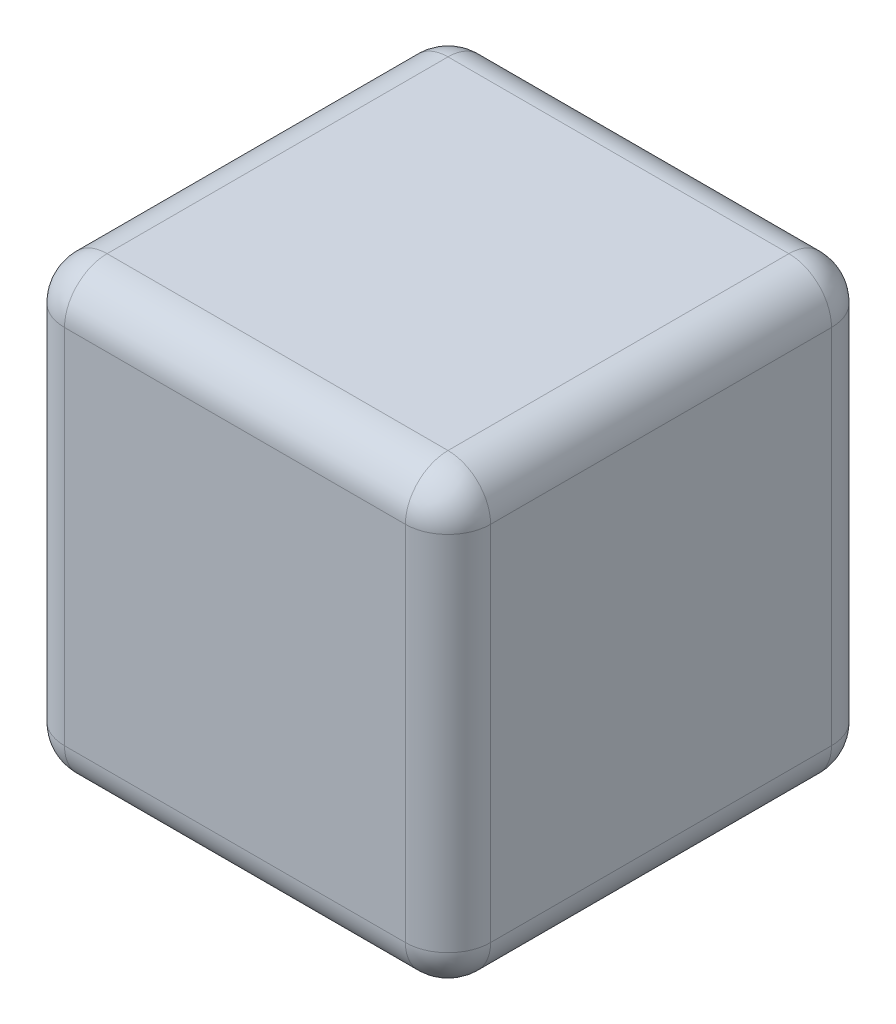
ISO-10303-21;
HEADER;
FILE_DESCRIPTION(('STEP AP214'),'2;1');
FILE_NAME('part.step','',(''),(''),'','','');
FILE_SCHEMA(('AUTOMOTIVE_DESIGN { 1 0 10303 214 1 1 1 1 }'));
ENDSEC;
DATA;
#1=APPLICATION_CONTEXT('core data for automotive mechanical design processes');
#2=APPLICATION_PROTOCOL_DEFINITION('international standard','automotive_design',2000,#1);
#3=PRODUCT_CONTEXT('',#1,'mechanical');
#4=PRODUCT('Part','Part','',(#3));
#5=PRODUCT_RELATED_PRODUCT_CATEGORY('part','',(#4));
#6=PRODUCT_DEFINITION_FORMATION('','',#4);
#7=PRODUCT_DEFINITION_CONTEXT('part definition',#1,'design');
#8=PRODUCT_DEFINITION('design','',#6,#7);
#9=PRODUCT_DEFINITION_SHAPE('','',#8);
#10=(LENGTH_UNIT() NAMED_UNIT(*) SI_UNIT(.MILLI.,.METRE.));
#11=(NAMED_UNIT(*) PLANE_ANGLE_UNIT() SI_UNIT($,.RADIAN.));
#12=(NAMED_UNIT(*) SI_UNIT($,.STERADIAN.) SOLID_ANGLE_UNIT());
#13=UNCERTAINTY_MEASURE_WITH_UNIT(LENGTH_MEASURE(1.E-05),#10,'distance_accuracy_value','');
#14=(GEOMETRIC_REPRESENTATION_CONTEXT(3) GLOBAL_UNCERTAINTY_ASSIGNED_CONTEXT((#13)) GLOBAL_UNIT_ASSIGNED_CONTEXT((#10,
#11,#12)) REPRESENTATION_CONTEXT('',''));
#15=CARTESIAN_POINT('',(0.,0.,0.));
#16=DIRECTION('',(0.,0.,1.));
#17=DIRECTION('',(1.,0.,0.));
#18=AXIS2_PLACEMENT_3D('',#15,#16,#17);
#19=CARTESIAN_POINT('',(0.,105.,0.));
#20=DIRECTION('',(1.,0.,0.));
#21=DIRECTION('',(0.,0.,-1.));
#22=AXIS2_PLACEMENT_3D('',#19,#20,#21);
#23=PLANE('',#22);
#24=DIRECTION('',(0.,0.,1.));
#25=VECTOR('',#24,1.);
#26=CARTESIAN_POINT('',(0.,95.,0.));
#27=LINE('',#26,#25);
#28=CARTESIAN_POINT('',(0.,95.,-10.));
#29=VERTEX_POINT('',#28);
#30=CARTESIAN_POINT('',(0.,95.,-90.));
#31=VERTEX_POINT('',#30);
#32=EDGE_CURVE('E173',#29,#31,#27,.F.);
#33=ORIENTED_EDGE('',*,*,#32,.T.);
#34=DIRECTION('',(0.,-1.,0.));
#35=VECTOR('',#34,1.);
#36=CARTESIAN_POINT('',(0.,105.,-90.));
#37=LINE('',#36,#35);
#38=CARTESIAN_POINT('',(0.,9.99999999999999,-90.));
#39=VERTEX_POINT('',#38);
#40=EDGE_CURVE('E179',#31,#39,#37,.T.);
#41=ORIENTED_EDGE('',*,*,#40,.T.);
#42=DIRECTION('',(0.,0.,1.));
#43=VECTOR('',#42,1.);
#44=CARTESIAN_POINT('',(0.,9.99999999999999,0.));
#45=LINE('',#44,#43);
#46=CARTESIAN_POINT('',(0.,9.99999999999999,-10.));
#47=VERTEX_POINT('',#46);
#48=EDGE_CURVE('E177',#39,#47,#45,.T.);
#49=ORIENTED_EDGE('',*,*,#48,.T.);
#50=DIRECTION('',(0.,-1.,0.));
#51=VECTOR('',#50,1.);
#52=CARTESIAN_POINT('',(0.,105.,-10.));
#53=LINE('',#52,#51);
#54=EDGE_CURVE('E175',#47,#29,#53,.F.);
#55=ORIENTED_EDGE('',*,*,#54,.T.);
#56=EDGE_LOOP('',(#33,#41,#49,#55));
#57=FACE_BOUND('',#56,.T.);
#58=ADVANCED_FACE('F33',(#57),#23,.F.);
#59=CARTESIAN_POINT('',(0.,105.,0.));
#60=DIRECTION('',(0.,0.,-1.));
#61=DIRECTION('',(-1.,0.,0.));
#62=AXIS2_PLACEMENT_3D('',#59,#60,#61);
#63=PLANE('',#62);
#64=DIRECTION('',(1.,0.,0.));
#65=VECTOR('',#64,1.);
#66=CARTESIAN_POINT('',(0.,95.,0.));
#67=LINE('',#66,#65);
#68=CARTESIAN_POINT('',(90.,95.,0.));
#69=VERTEX_POINT('',#68);
#70=CARTESIAN_POINT('',(10.,95.,0.));
#71=VERTEX_POINT('',#70);
#72=EDGE_CURVE('E184',#69,#71,#67,.F.);
#73=ORIENTED_EDGE('',*,*,#72,.T.);
#74=DIRECTION('',(0.,-1.,0.));
#75=VECTOR('',#74,1.);
#76=CARTESIAN_POINT('',(10.,105.,0.));
#77=LINE('',#76,#75);
#78=CARTESIAN_POINT('',(10.,9.99999999999999,0.));
#79=VERTEX_POINT('',#78);
#80=EDGE_CURVE('E188',#71,#79,#77,.T.);
#81=ORIENTED_EDGE('',*,*,#80,.T.);
#82=DIRECTION('',(1.,0.,0.));
#83=VECTOR('',#82,1.);
#84=CARTESIAN_POINT('',(100.,9.99999999999999,0.));
#85=LINE('',#84,#83);
#86=CARTESIAN_POINT('',(90.,9.99999999999999,0.));
#87=VERTEX_POINT('',#86);
#88=EDGE_CURVE('E186',#79,#87,#85,.T.);
#89=ORIENTED_EDGE('',*,*,#88,.T.);
#90=DIRECTION('',(0.,-1.,0.));
#91=VECTOR('',#90,1.);
#92=CARTESIAN_POINT('',(90.,105.,0.));
#93=LINE('',#92,#91);
#94=EDGE_CURVE('E182',#87,#69,#93,.F.);
#95=ORIENTED_EDGE('',*,*,#94,.T.);
#96=EDGE_LOOP('',(#73,#81,#89,#95));
#97=FACE_BOUND('',#96,.T.);
#98=ADVANCED_FACE('F272',(#97),#63,.F.);
#99=CARTESIAN_POINT('',(100.,105.,0.));
#100=DIRECTION('',(-1.,0.,0.));
#101=DIRECTION('',(0.,0.,1.));
#102=AXIS2_PLACEMENT_3D('',#99,#100,#101);
#103=PLANE('',#102);
#104=DIRECTION('',(0.,0.,-1.));
#105=VECTOR('',#104,1.);
#106=CARTESIAN_POINT('',(100.,95.,0.));
#107=LINE('',#106,#105);
#108=CARTESIAN_POINT('',(100.,95.,-90.));
#109=VERTEX_POINT('',#108);
#110=CARTESIAN_POINT('',(100.,95.,-10.));
#111=VERTEX_POINT('',#110);
#112=EDGE_CURVE('E42',#109,#111,#107,.F.);
#113=ORIENTED_EDGE('',*,*,#112,.T.);
#114=DIRECTION('',(0.,-1.,0.));
#115=VECTOR('',#114,1.);
#116=CARTESIAN_POINT('',(100.,105.,-10.));
#117=LINE('',#116,#115);
#118=CARTESIAN_POINT('',(100.,9.99999999999999,-10.));
#119=VERTEX_POINT('',#118);
#120=EDGE_CURVE('E11',#111,#119,#117,.T.);
#121=ORIENTED_EDGE('',*,*,#120,.T.);
#122=DIRECTION('',(0.,0.,-1.));
#123=VECTOR('',#122,1.);
#124=CARTESIAN_POINT('',(100.,9.99999999999999,-100.));
#125=LINE('',#124,#123);
#126=CARTESIAN_POINT('',(100.,9.99999999999999,-90.));
#127=VERTEX_POINT('',#126);
#128=EDGE_CURVE('E198',#119,#127,#125,.T.);
#129=ORIENTED_EDGE('',*,*,#128,.T.);
#130=DIRECTION('',(0.,-1.,0.));
#131=VECTOR('',#130,1.);
#132=CARTESIAN_POINT('',(100.,105.,-90.));
#133=LINE('',#132,#131);
#134=EDGE_CURVE('E53',#127,#109,#133,.F.);
#135=ORIENTED_EDGE('',*,*,#134,.T.);
#136=EDGE_LOOP('',(#113,#121,#129,#135));
#137=FACE_BOUND('',#136,.T.);
#138=ADVANCED_FACE('F285',(#137),#103,.F.);
#139=CARTESIAN_POINT('',(0.,105.,-100.));
#140=DIRECTION('',(0.,0.,1.));
#141=DIRECTION('',(1.,0.,0.));
#142=AXIS2_PLACEMENT_3D('',#139,#140,#141);
#143=PLANE('',#142);
#144=DIRECTION('',(0.,-1.,0.));
#145=VECTOR('',#144,1.);
#146=CARTESIAN_POINT('',(90.,105.,-100.));
#147=LINE('',#146,#145);
#148=CARTESIAN_POINT('',(90.,95.,-100.));
#149=VERTEX_POINT('',#148);
#150=CARTESIAN_POINT('',(90.,9.99999999999999,-100.));
#151=VERTEX_POINT('',#150);
#152=EDGE_CURVE('E125',#149,#151,#147,.T.);
#153=ORIENTED_EDGE('',*,*,#152,.T.);
#154=DIRECTION('',(-1.,0.,0.));
#155=VECTOR('',#154,1.);
#156=CARTESIAN_POINT('',(0.,9.99999999999999,-100.));
#157=LINE('',#156,#155);
#158=CARTESIAN_POINT('',(10.,9.99999999999999,-100.));
#159=VERTEX_POINT('',#158);
#160=EDGE_CURVE('E162',#151,#159,#157,.T.);
#161=ORIENTED_EDGE('',*,*,#160,.T.);
#162=DIRECTION('',(0.,-1.,0.));
#163=VECTOR('',#162,1.);
#164=CARTESIAN_POINT('',(10.,105.,-100.));
#165=LINE('',#164,#163);
#166=CARTESIAN_POINT('',(10.,95.,-100.));
#167=VERTEX_POINT('',#166);
#168=EDGE_CURVE('E128',#159,#167,#165,.F.);
#169=ORIENTED_EDGE('',*,*,#168,.T.);
#170=DIRECTION('',(-1.,0.,0.));
#171=VECTOR('',#170,1.);
#172=CARTESIAN_POINT('',(0.,95.,-100.));
#173=LINE('',#172,#171);
#174=EDGE_CURVE('E120',#167,#149,#173,.F.);
#175=ORIENTED_EDGE('',*,*,#174,.T.);
#176=EDGE_LOOP('',(#153,#161,#169,#175));
#177=FACE_BOUND('',#176,.T.);
#178=ADVANCED_FACE('F122',(#177),#143,.F.);
#179=CARTESIAN_POINT('',(0.,105.,0.));
#180=DIRECTION('',(0.,-1.,0.));
#181=DIRECTION('',(0.,0.,-1.));
#182=AXIS2_PLACEMENT_3D('',#179,#180,#181);
#183=PLANE('',#182);
#184=DIRECTION('',(-1.,0.,0.));
#185=VECTOR('',#184,1.);
#186=CARTESIAN_POINT('',(0.,105.,-90.));
#187=LINE('',#186,#185);
#188=CARTESIAN_POINT('',(90.,105.,-90.));
#189=VERTEX_POINT('',#188);
#190=CARTESIAN_POINT('',(10.,105.,-90.));
#191=VERTEX_POINT('',#190);
#192=EDGE_CURVE('E139',#189,#191,#187,.T.);
#193=ORIENTED_EDGE('',*,*,#192,.T.);
#194=DIRECTION('',(0.,0.,1.));
#195=VECTOR('',#194,1.);
#196=CARTESIAN_POINT('',(10.,105.,0.));
#197=LINE('',#196,#195);
#198=CARTESIAN_POINT('',(10.,105.,-10.));
#199=VERTEX_POINT('',#198);
#200=EDGE_CURVE('E196',#191,#199,#197,.T.);
#201=ORIENTED_EDGE('',*,*,#200,.T.);
#202=DIRECTION('',(1.,0.,0.));
#203=VECTOR('',#202,1.);
#204=CARTESIAN_POINT('',(0.,105.,-10.));
#205=LINE('',#204,#203);
#206=CARTESIAN_POINT('',(90.,105.,-10.));
#207=VERTEX_POINT('',#206);
#208=EDGE_CURVE('E193',#199,#207,#205,.T.);
#209=ORIENTED_EDGE('',*,*,#208,.T.);
#210=DIRECTION('',(0.,0.,-1.));
#211=VECTOR('',#210,1.);
#212=CARTESIAN_POINT('',(90.,105.,0.));
#213=LINE('',#212,#211);
#214=EDGE_CURVE('E191',#207,#189,#213,.T.);
#215=ORIENTED_EDGE('',*,*,#214,.T.);
#216=EDGE_LOOP('',(#193,#201,#209,#215));
#217=FACE_BOUND('',#216,.T.);
#218=ADVANCED_FACE('F477',(#217),#183,.F.);
#219=CARTESIAN_POINT('',(0.,0.,0.));
#220=DIRECTION('',(0.,-1.,0.));
#221=DIRECTION('',(0.,0.,-1.));
#222=AXIS2_PLACEMENT_3D('',#219,#220,#221);
#223=PLANE('',#222);
#224=DIRECTION('',(0.,0.,1.));
#225=VECTOR('',#224,1.);
#226=CARTESIAN_POINT('',(10.,0.,-100.));
#227=LINE('',#226,#225);
#228=CARTESIAN_POINT('',(10.,0.,-10.));
#229=VERTEX_POINT('',#228);
#230=CARTESIAN_POINT('',(10.,0.,-90.));
#231=VERTEX_POINT('',#230);
#232=EDGE_CURVE('E168',#229,#231,#227,.F.);
#233=ORIENTED_EDGE('',*,*,#232,.T.);
#234=DIRECTION('',(-1.,0.,0.));
#235=VECTOR('',#234,1.);
#236=CARTESIAN_POINT('',(100.,0.,-90.));
#237=LINE('',#236,#235);
#238=CARTESIAN_POINT('',(90.,0.,-90.));
#239=VERTEX_POINT('',#238);
#240=EDGE_CURVE('E170',#231,#239,#237,.F.);
#241=ORIENTED_EDGE('',*,*,#240,.T.);
#242=DIRECTION('',(0.,0.,-1.));
#243=VECTOR('',#242,1.);
#244=CARTESIAN_POINT('',(90.,0.,0.));
#245=LINE('',#244,#243);
#246=CARTESIAN_POINT('',(90.,0.,-10.));
#247=VERTEX_POINT('',#246);
#248=EDGE_CURVE('E164',#239,#247,#245,.F.);
#249=ORIENTED_EDGE('',*,*,#248,.T.);
#250=DIRECTION('',(1.,0.,0.));
#251=VECTOR('',#250,1.);
#252=CARTESIAN_POINT('',(0.,0.,-10.));
#253=LINE('',#252,#251);
#254=EDGE_CURVE('E166',#247,#229,#253,.F.);
#255=ORIENTED_EDGE('',*,*,#254,.T.);
#256=EDGE_LOOP('',(#233,#241,#249,#255));
#257=FACE_BOUND('',#256,.T.);
#258=ADVANCED_FACE('F470',(#257),#223,.T.);
#259=CARTESIAN_POINT('',(0.,95.,-10.));
#260=DIRECTION('',(1.,0.,0.));
#261=DIRECTION('',(0.,0.,-1.));
#262=AXIS2_PLACEMENT_3D('',#259,#260,#261);
#263=CYLINDRICAL_SURFACE('',#262,10.);
#264=CARTESIAN_POINT('',(90.,95.,-10.));
#265=DIRECTION('',(1.,0.,0.));
#266=DIRECTION('',(0.,0.,-1.));
#267=AXIS2_PLACEMENT_3D('',#264,#265,#266);
#268=CIRCLE('',#267,10.);
#269=EDGE_CURVE('E37',#207,#69,#268,.T.);
#270=ORIENTED_EDGE('',*,*,#269,.F.);
#271=ORIENTED_EDGE('',*,*,#208,.F.);
#272=CARTESIAN_POINT('',(10.,95.,-10.));
#273=DIRECTION('',(-1.,0.,0.));
#274=DIRECTION('',(0.,0.,1.));
#275=AXIS2_PLACEMENT_3D('',#272,#273,#274);
#276=CIRCLE('',#275,10.);
#277=EDGE_CURVE('E159',#71,#199,#276,.T.);
#278=ORIENTED_EDGE('',*,*,#277,.F.);
#279=ORIENTED_EDGE('',*,*,#72,.F.);
#280=EDGE_LOOP('',(#270,#271,#278,#279));
#281=FACE_BOUND('',#280,.T.);
#282=ADVANCED_FACE('F35',(#281),#263,.T.);
#283=CARTESIAN_POINT('',(90.,95.,-10.));
#284=DIRECTION('',(0.,0.,1.));
#285=DIRECTION('',(1.,0.,0.));
#286=AXIS2_PLACEMENT_3D('',#283,#284,#285);
#287=SPHERICAL_SURFACE('',#286,10.);
#288=CARTESIAN_POINT('',(90.,95.,-10.));
#289=DIRECTION('',(0.,0.,1.));
#290=DIRECTION('',(1.,0.,0.));
#291=AXIS2_PLACEMENT_3D('',#288,#289,#290);
#292=CIRCLE('',#291,10.);
#293=EDGE_CURVE('E243',#207,#111,#292,.F.);
#294=ORIENTED_EDGE('',*,*,#293,.F.);
#295=ORIENTED_EDGE('',*,*,#269,.T.);
#296=CARTESIAN_POINT('',(90.,95.,-10.));
#297=DIRECTION('',(0.,1.,0.));
#298=DIRECTION('',(0.,0.,1.));
#299=AXIS2_PLACEMENT_3D('',#296,#297,#298);
#300=CIRCLE('',#299,10.);
#301=EDGE_CURVE('E245',#111,#69,#300,.F.);
#302=ORIENTED_EDGE('',*,*,#301,.F.);
#303=EDGE_LOOP('',(#294,#295,#302));
#304=FACE_BOUND('',#303,.T.);
#305=ADVANCED_FACE('F278',(#304),#287,.T.);
#306=CARTESIAN_POINT('',(10.,95.,-10.));
#307=DIRECTION('',(0.,0.,1.));
#308=DIRECTION('',(1.,0.,0.));
#309=AXIS2_PLACEMENT_3D('',#306,#307,#308);
#310=SPHERICAL_SURFACE('',#309,10.);
#311=CARTESIAN_POINT('',(10.,95.,-10.));
#312=DIRECTION('',(0.,1.,0.));
#313=DIRECTION('',(0.,0.,1.));
#314=AXIS2_PLACEMENT_3D('',#311,#312,#313);
#315=CIRCLE('',#314,10.);
#316=EDGE_CURVE('E237',#71,#29,#315,.F.);
#317=ORIENTED_EDGE('',*,*,#316,.F.);
#318=ORIENTED_EDGE('',*,*,#277,.T.);
#319=CARTESIAN_POINT('',(10.,95.,-10.));
#320=DIRECTION('',(0.,0.,1.));
#321=DIRECTION('',(1.,0.,0.));
#322=AXIS2_PLACEMENT_3D('',#319,#320,#321);
#323=CIRCLE('',#322,10.);
#324=EDGE_CURVE('E240',#29,#199,#323,.F.);
#325=ORIENTED_EDGE('',*,*,#324,.F.);
#326=EDGE_LOOP('',(#317,#318,#325));
#327=FACE_BOUND('',#326,.T.);
#328=ADVANCED_FACE('F252',(#327),#310,.T.);
#329=CARTESIAN_POINT('',(90.,105.,-10.));
#330=DIRECTION('',(0.,-1.,0.));
#331=DIRECTION('',(0.,0.,-1.));
#332=AXIS2_PLACEMENT_3D('',#329,#330,#331);
#333=CYLINDRICAL_SURFACE('',#332,10.);
#334=ORIENTED_EDGE('',*,*,#301,.T.);
#335=ORIENTED_EDGE('',*,*,#94,.F.);
#336=CARTESIAN_POINT('',(90.,9.99999999999999,-10.));
#337=DIRECTION('',(0.,-1.,0.));
#338=DIRECTION('',(0.,0.,-1.));
#339=AXIS2_PLACEMENT_3D('',#336,#337,#338);
#340=CIRCLE('',#339,10.);
#341=EDGE_CURVE('E231',#119,#87,#340,.T.);
#342=ORIENTED_EDGE('',*,*,#341,.F.);
#343=ORIENTED_EDGE('',*,*,#120,.F.);
#344=EDGE_LOOP('',(#334,#335,#342,#343));
#345=FACE_BOUND('',#344,.T.);
#346=ADVANCED_FACE('F282',(#345),#333,.T.);
#347=CARTESIAN_POINT('',(90.,95.,0.));
#348=DIRECTION('',(0.,0.,-1.));
#349=DIRECTION('',(-1.,0.,0.));
#350=AXIS2_PLACEMENT_3D('',#347,#348,#349);
#351=CYLINDRICAL_SURFACE('',#350,10.);
#352=ORIENTED_EDGE('',*,*,#293,.T.);
#353=ORIENTED_EDGE('',*,*,#112,.F.);
#354=CARTESIAN_POINT('',(90.,95.,-90.));
#355=DIRECTION('',(0.,0.,-1.));
#356=DIRECTION('',(-1.,0.,0.));
#357=AXIS2_PLACEMENT_3D('',#354,#355,#356);
#358=CIRCLE('',#357,10.);
#359=EDGE_CURVE('E143',#189,#109,#358,.T.);
#360=ORIENTED_EDGE('',*,*,#359,.F.);
#361=ORIENTED_EDGE('',*,*,#214,.F.);
#362=EDGE_LOOP('',(#352,#353,#360,#361));
#363=FACE_BOUND('',#362,.T.);
#364=ADVANCED_FACE('F434',(#363),#351,.T.);
#365=CARTESIAN_POINT('',(0.,95.,-90.));
#366=DIRECTION('',(-1.,0.,0.));
#367=DIRECTION('',(0.,0.,1.));
#368=AXIS2_PLACEMENT_3D('',#365,#366,#367);
#369=CYLINDRICAL_SURFACE('',#368,10.);
#370=CARTESIAN_POINT('',(10.,95.,-90.));
#371=DIRECTION('',(-1.,0.,0.));
#372=DIRECTION('',(0.,0.,1.));
#373=AXIS2_PLACEMENT_3D('',#370,#371,#372);
#374=CIRCLE('',#373,10.);
#375=EDGE_CURVE('E144',#191,#167,#374,.T.);
#376=ORIENTED_EDGE('',*,*,#375,.F.);
#377=ORIENTED_EDGE('',*,*,#192,.F.);
#378=CARTESIAN_POINT('',(90.,95.,-90.));
#379=DIRECTION('',(1.,0.,0.));
#380=DIRECTION('',(0.,0.,-1.));
#381=AXIS2_PLACEMENT_3D('',#378,#379,#380);
#382=CIRCLE('',#381,10.);
#383=EDGE_CURVE('E135',#149,#189,#382,.T.);
#384=ORIENTED_EDGE('',*,*,#383,.F.);
#385=ORIENTED_EDGE('',*,*,#174,.F.);
#386=EDGE_LOOP('',(#376,#377,#384,#385));
#387=FACE_BOUND('',#386,.T.);
#388=ADVANCED_FACE('F137',(#387),#369,.T.);
#389=CARTESIAN_POINT('',(10.,95.,0.));
#390=DIRECTION('',(0.,0.,1.));
#391=DIRECTION('',(1.,0.,0.));
#392=AXIS2_PLACEMENT_3D('',#389,#390,#391);
#393=CYLINDRICAL_SURFACE('',#392,10.);
#394=ORIENTED_EDGE('',*,*,#324,.T.);
#395=ORIENTED_EDGE('',*,*,#200,.F.);
#396=CARTESIAN_POINT('',(10.,95.,-90.));
#397=DIRECTION('',(0.,0.,-1.));
#398=DIRECTION('',(-1.,0.,0.));
#399=AXIS2_PLACEMENT_3D('',#396,#397,#398);
#400=CIRCLE('',#399,10.);
#401=EDGE_CURVE('E227',#31,#191,#400,.T.);
#402=ORIENTED_EDGE('',*,*,#401,.F.);
#403=ORIENTED_EDGE('',*,*,#32,.F.);
#404=EDGE_LOOP('',(#394,#395,#402,#403));
#405=FACE_BOUND('',#404,.T.);
#406=ADVANCED_FACE('F260',(#405),#393,.T.);
#407=CARTESIAN_POINT('',(10.,105.,-10.));
#408=DIRECTION('',(0.,-1.,0.));
#409=DIRECTION('',(0.,0.,-1.));
#410=AXIS2_PLACEMENT_3D('',#407,#408,#409);
#411=CYLINDRICAL_SURFACE('',#410,10.);
#412=ORIENTED_EDGE('',*,*,#316,.T.);
#413=ORIENTED_EDGE('',*,*,#54,.F.);
#414=CARTESIAN_POINT('',(10.,9.99999999999999,-10.));
#415=DIRECTION('',(0.,-1.,0.));
#416=DIRECTION('',(0.,0.,-1.));
#417=AXIS2_PLACEMENT_3D('',#414,#415,#416);
#418=CIRCLE('',#417,10.);
#419=EDGE_CURVE('E224',#79,#47,#418,.T.);
#420=ORIENTED_EDGE('',*,*,#419,.F.);
#421=ORIENTED_EDGE('',*,*,#80,.F.);
#422=EDGE_LOOP('',(#412,#413,#420,#421));
#423=FACE_BOUND('',#422,.T.);
#424=ADVANCED_FACE('F269',(#423),#411,.T.);
#425=CARTESIAN_POINT('',(0.,9.99999999999999,-10.));
#426=DIRECTION('',(-1.,0.,0.));
#427=DIRECTION('',(0.,0.,1.));
#428=AXIS2_PLACEMENT_3D('',#425,#426,#427);
#429=CYLINDRICAL_SURFACE('',#428,10.);
#430=CARTESIAN_POINT('',(90.,9.99999999999999,-10.));
#431=DIRECTION('',(1.,0.,0.));
#432=DIRECTION('',(0.,0.,-1.));
#433=AXIS2_PLACEMENT_3D('',#430,#431,#432);
#434=CIRCLE('',#433,10.);
#435=EDGE_CURVE('E234',#87,#247,#434,.T.);
#436=ORIENTED_EDGE('',*,*,#435,.F.);
#437=ORIENTED_EDGE('',*,*,#88,.F.);
#438=CARTESIAN_POINT('',(10.,10.,-10.));
#439=DIRECTION('',(-1.,0.,0.));
#440=DIRECTION('',(0.,0.,1.));
#441=AXIS2_PLACEMENT_3D('',#438,#439,#440);
#442=CIRCLE('',#441,10.);
#443=EDGE_CURVE('E222',#229,#79,#442,.T.);
#444=ORIENTED_EDGE('',*,*,#443,.F.);
#445=ORIENTED_EDGE('',*,*,#254,.F.);
#446=EDGE_LOOP('',(#436,#437,#444,#445));
#447=FACE_BOUND('',#446,.T.);
#448=ADVANCED_FACE('F403',(#447),#429,.T.);
#449=CARTESIAN_POINT('',(90.,10.,-10.));
#450=DIRECTION('',(0.,0.,1.));
#451=DIRECTION('',(1.,0.,0.));
#452=AXIS2_PLACEMENT_3D('',#449,#450,#451);
#453=SPHERICAL_SURFACE('',#452,10.);
#454=ORIENTED_EDGE('',*,*,#341,.T.);
#455=ORIENTED_EDGE('',*,*,#435,.T.);
#456=CARTESIAN_POINT('',(90.,10.,-10.));
#457=DIRECTION('',(0.,0.,1.));
#458=DIRECTION('',(1.,0.,0.));
#459=AXIS2_PLACEMENT_3D('',#456,#457,#458);
#460=CIRCLE('',#459,10.);
#461=EDGE_CURVE('E150',#119,#247,#460,.F.);
#462=ORIENTED_EDGE('',*,*,#461,.F.);
#463=EDGE_LOOP('',(#454,#455,#462));
#464=FACE_BOUND('',#463,.T.);
#465=ADVANCED_FACE('F315',(#464),#453,.T.);
#466=CARTESIAN_POINT('',(90.,95.,-90.));
#467=DIRECTION('',(0.,0.,1.));
#468=DIRECTION('',(1.,0.,0.));
#469=AXIS2_PLACEMENT_3D('',#466,#467,#468);
#470=SPHERICAL_SURFACE('',#469,10.);
#471=ORIENTED_EDGE('',*,*,#383,.T.);
#472=ORIENTED_EDGE('',*,*,#359,.T.);
#473=CARTESIAN_POINT('',(90.,95.,-90.));
#474=DIRECTION('',(0.,1.,0.));
#475=DIRECTION('',(0.,0.,1.));
#476=AXIS2_PLACEMENT_3D('',#473,#474,#475);
#477=CIRCLE('',#476,10.);
#478=EDGE_CURVE('E147',#149,#109,#477,.F.);
#479=ORIENTED_EDGE('',*,*,#478,.F.);
#480=EDGE_LOOP('',(#471,#472,#479));
#481=FACE_BOUND('',#480,.T.);
#482=ADVANCED_FACE('F148',(#481),#470,.T.);
#483=CARTESIAN_POINT('',(10.,95.,-90.));
#484=DIRECTION('',(0.,0.,1.));
#485=DIRECTION('',(1.,0.,0.));
#486=AXIS2_PLACEMENT_3D('',#483,#484,#485);
#487=SPHERICAL_SURFACE('',#486,10.);
#488=ORIENTED_EDGE('',*,*,#401,.T.);
#489=ORIENTED_EDGE('',*,*,#375,.T.);
#490=CARTESIAN_POINT('',(10.,95.,-90.));
#491=DIRECTION('',(0.,1.,0.));
#492=DIRECTION('',(0.,0.,1.));
#493=AXIS2_PLACEMENT_3D('',#490,#491,#492);
#494=CIRCLE('',#493,10.);
#495=EDGE_CURVE('E151',#31,#167,#494,.F.);
#496=ORIENTED_EDGE('',*,*,#495,.F.);
#497=EDGE_LOOP('',(#488,#489,#496));
#498=FACE_BOUND('',#497,.T.);
#499=ADVANCED_FACE('F305',(#498),#487,.T.);
#500=CARTESIAN_POINT('',(10.,10.,-10.));
#501=DIRECTION('',(0.,0.,1.));
#502=DIRECTION('',(1.,0.,0.));
#503=AXIS2_PLACEMENT_3D('',#500,#501,#502);
#504=SPHERICAL_SURFACE('',#503,10.);
#505=ORIENTED_EDGE('',*,*,#443,.T.);
#506=ORIENTED_EDGE('',*,*,#419,.T.);
#507=CARTESIAN_POINT('',(10.,9.99999999999999,-10.));
#508=DIRECTION('',(0.,0.,1.));
#509=DIRECTION('',(1.,0.,0.));
#510=AXIS2_PLACEMENT_3D('',#507,#508,#509);
#511=CIRCLE('',#510,10.);
#512=EDGE_CURVE('E215',#229,#47,#511,.F.);
#513=ORIENTED_EDGE('',*,*,#512,.F.);
#514=EDGE_LOOP('',(#505,#506,#513));
#515=FACE_BOUND('',#514,.T.);
#516=ADVANCED_FACE('F307',(#515),#504,.T.);
#517=CARTESIAN_POINT('',(90.,9.99999999999999,0.));
#518=DIRECTION('',(0.,0.,1.));
#519=DIRECTION('',(1.,0.,0.));
#520=AXIS2_PLACEMENT_3D('',#517,#518,#519);
#521=CYLINDRICAL_SURFACE('',#520,10.);
#522=ORIENTED_EDGE('',*,*,#461,.T.);
#523=ORIENTED_EDGE('',*,*,#248,.F.);
#524=CARTESIAN_POINT('',(90.,9.99999999999999,-90.));
#525=DIRECTION('',(0.,0.,-1.));
#526=DIRECTION('',(-1.,0.,0.));
#527=AXIS2_PLACEMENT_3D('',#524,#525,#526);
#528=CIRCLE('',#527,10.);
#529=EDGE_CURVE('E212',#127,#239,#528,.T.);
#530=ORIENTED_EDGE('',*,*,#529,.F.);
#531=ORIENTED_EDGE('',*,*,#128,.F.);
#532=EDGE_LOOP('',(#522,#523,#530,#531));
#533=FACE_BOUND('',#532,.T.);
#534=ADVANCED_FACE('F290',(#533),#521,.T.);
#535=CARTESIAN_POINT('',(90.,105.,-90.));
#536=DIRECTION('',(0.,-1.,0.));
#537=DIRECTION('',(0.,0.,-1.));
#538=AXIS2_PLACEMENT_3D('',#535,#536,#537);
#539=CYLINDRICAL_SURFACE('',#538,10.);
#540=ORIENTED_EDGE('',*,*,#478,.T.);
#541=ORIENTED_EDGE('',*,*,#134,.F.);
#542=CARTESIAN_POINT('',(90.,9.99999999999999,-90.));
#543=DIRECTION('',(0.,-1.,0.));
#544=DIRECTION('',(0.,0.,-1.));
#545=AXIS2_PLACEMENT_3D('',#542,#543,#544);
#546=CIRCLE('',#545,10.);
#547=EDGE_CURVE('E155',#151,#127,#546,.T.);
#548=ORIENTED_EDGE('',*,*,#547,.F.);
#549=ORIENTED_EDGE('',*,*,#152,.F.);
#550=EDGE_LOOP('',(#540,#541,#548,#549));
#551=FACE_BOUND('',#550,.T.);
#552=ADVANCED_FACE('F153',(#551),#539,.T.);
#553=CARTESIAN_POINT('',(10.,105.,-90.));
#554=DIRECTION('',(0.,-1.,0.));
#555=DIRECTION('',(0.,0.,-1.));
#556=AXIS2_PLACEMENT_3D('',#553,#554,#555);
#557=CYLINDRICAL_SURFACE('',#556,10.);
#558=ORIENTED_EDGE('',*,*,#495,.T.);
#559=ORIENTED_EDGE('',*,*,#168,.F.);
#560=CARTESIAN_POINT('',(10.,9.99999999999999,-90.));
#561=DIRECTION('',(0.,-1.,0.));
#562=DIRECTION('',(0.,0.,-1.));
#563=AXIS2_PLACEMENT_3D('',#560,#561,#562);
#564=CIRCLE('',#563,10.);
#565=EDGE_CURVE('E208',#39,#159,#564,.T.);
#566=ORIENTED_EDGE('',*,*,#565,.F.);
#567=ORIENTED_EDGE('',*,*,#40,.F.);
#568=EDGE_LOOP('',(#558,#559,#566,#567));
#569=FACE_BOUND('',#568,.T.);
#570=ADVANCED_FACE('F303',(#569),#557,.T.);
#571=CARTESIAN_POINT('',(10.,9.99999999999999,0.));
#572=DIRECTION('',(0.,0.,-1.));
#573=DIRECTION('',(-1.,0.,0.));
#574=AXIS2_PLACEMENT_3D('',#571,#572,#573);
#575=CYLINDRICAL_SURFACE('',#574,10.);
#576=ORIENTED_EDGE('',*,*,#512,.T.);
#577=ORIENTED_EDGE('',*,*,#48,.F.);
#578=CARTESIAN_POINT('',(10.,10.,-90.));
#579=DIRECTION('',(0.,0.,-1.));
#580=DIRECTION('',(-1.,0.,0.));
#581=AXIS2_PLACEMENT_3D('',#578,#579,#580);
#582=CIRCLE('',#581,10.);
#583=EDGE_CURVE('E206',#231,#39,#582,.T.);
#584=ORIENTED_EDGE('',*,*,#583,.F.);
#585=ORIENTED_EDGE('',*,*,#232,.F.);
#586=EDGE_LOOP('',(#576,#577,#584,#585));
#587=FACE_BOUND('',#586,.T.);
#588=ADVANCED_FACE('F331',(#587),#575,.T.);
#589=CARTESIAN_POINT('',(90.,10.,-90.));
#590=DIRECTION('',(0.,0.,1.));
#591=DIRECTION('',(1.,0.,0.));
#592=AXIS2_PLACEMENT_3D('',#589,#590,#591);
#593=SPHERICAL_SURFACE('',#592,10.);
#594=ORIENTED_EDGE('',*,*,#547,.T.);
#595=ORIENTED_EDGE('',*,*,#529,.T.);
#596=CARTESIAN_POINT('',(90.,10.,-90.));
#597=DIRECTION('',(1.,0.,0.));
#598=DIRECTION('',(0.,0.,-1.));
#599=AXIS2_PLACEMENT_3D('',#596,#597,#598);
#600=CIRCLE('',#599,10.);
#601=EDGE_CURVE('E204',#151,#239,#600,.F.);
#602=ORIENTED_EDGE('',*,*,#601,.F.);
#603=EDGE_LOOP('',(#594,#595,#602));
#604=FACE_BOUND('',#603,.T.);
#605=ADVANCED_FACE('F292',(#604),#593,.T.);
#606=CARTESIAN_POINT('',(10.,10.,-90.));
#607=DIRECTION('',(0.,0.,1.));
#608=DIRECTION('',(1.,0.,0.));
#609=AXIS2_PLACEMENT_3D('',#606,#607,#608);
#610=SPHERICAL_SURFACE('',#609,10.);
#611=ORIENTED_EDGE('',*,*,#583,.T.);
#612=ORIENTED_EDGE('',*,*,#565,.T.);
#613=CARTESIAN_POINT('',(10.,9.99999999999999,-90.));
#614=DIRECTION('',(-1.,0.,0.));
#615=DIRECTION('',(0.,0.,1.));
#616=AXIS2_PLACEMENT_3D('',#613,#614,#615);
#617=CIRCLE('',#616,10.);
#618=EDGE_CURVE('E202',#231,#159,#617,.F.);
#619=ORIENTED_EDGE('',*,*,#618,.F.);
#620=EDGE_LOOP('',(#611,#612,#619));
#621=FACE_BOUND('',#620,.T.);
#622=ADVANCED_FACE('F300',(#621),#610,.T.);
#623=CARTESIAN_POINT('',(0.,9.99999999999999,-90.));
#624=DIRECTION('',(1.,0.,0.));
#625=DIRECTION('',(0.,0.,-1.));
#626=AXIS2_PLACEMENT_3D('',#623,#624,#625);
#627=CYLINDRICAL_SURFACE('',#626,10.);
#628=ORIENTED_EDGE('',*,*,#601,.T.);
#629=ORIENTED_EDGE('',*,*,#240,.F.);
#630=ORIENTED_EDGE('',*,*,#618,.T.);
#631=ORIENTED_EDGE('',*,*,#160,.F.);
#632=EDGE_LOOP('',(#628,#629,#630,#631));
#633=FACE_BOUND('',#632,.T.);
#634=ADVANCED_FACE('F296',(#633),#627,.T.);
#635=CLOSED_SHELL('',(#58,#98,#138,#178,#218,#258,#282,#305,#328,#346,#364,#388,#406,#424,#448,
#465,#482,#499,#516,#534,#552,#570,#588,#605,#622,#634));
#636=MANIFOLD_SOLID_BREP('B2',#635);
#637=ADVANCED_BREP_SHAPE_REPRESENTATION('',(#18,#636),#14);
#638=SHAPE_DEFINITION_REPRESENTATION(#9,#637);
ENDSEC;
END-ISO-10303-21;
